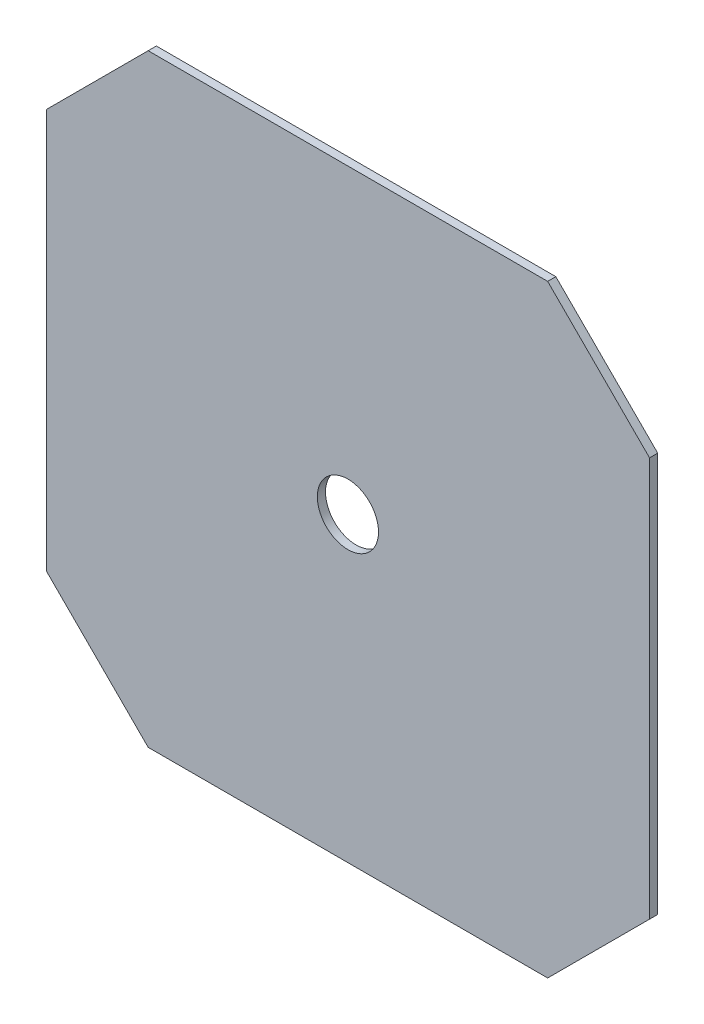
ISO-10303-21;
HEADER;
FILE_DESCRIPTION(('STEP AP214'),'2;1');
FILE_NAME('part.step','',(''),(''),'','','');
FILE_SCHEMA(('AUTOMOTIVE_DESIGN { 1 0 10303 214 1 1 1 1 }'));
ENDSEC;
DATA;
#1=APPLICATION_CONTEXT('core data for automotive mechanical design processes');
#2=APPLICATION_PROTOCOL_DEFINITION('international standard','automotive_design',2000,#1);
#3=PRODUCT_CONTEXT('',#1,'mechanical');
#4=PRODUCT('Part','Part','',(#3));
#5=PRODUCT_RELATED_PRODUCT_CATEGORY('part','',(#4));
#6=PRODUCT_DEFINITION_FORMATION('','',#4);
#7=PRODUCT_DEFINITION_CONTEXT('part definition',#1,'design');
#8=PRODUCT_DEFINITION('design','',#6,#7);
#9=PRODUCT_DEFINITION_SHAPE('','',#8);
#10=(LENGTH_UNIT() NAMED_UNIT(*) SI_UNIT(.MILLI.,.METRE.));
#11=(NAMED_UNIT(*) PLANE_ANGLE_UNIT() SI_UNIT($,.RADIAN.));
#12=(NAMED_UNIT(*) SI_UNIT($,.STERADIAN.) SOLID_ANGLE_UNIT());
#13=UNCERTAINTY_MEASURE_WITH_UNIT(LENGTH_MEASURE(1.E-05),#10,'distance_accuracy_value','');
#14=(GEOMETRIC_REPRESENTATION_CONTEXT(3) GLOBAL_UNCERTAINTY_ASSIGNED_CONTEXT((#13)) GLOBAL_UNIT_ASSIGNED_CONTEXT((#10,
#11,#12)) REPRESENTATION_CONTEXT('',''));
#15=CARTESIAN_POINT('',(0.,0.,0.));
#16=DIRECTION('',(0.,0.,1.));
#17=DIRECTION('',(1.,0.,0.));
#18=AXIS2_PLACEMENT_3D('',#15,#16,#17);
#19=CARTESIAN_POINT('',(-74.,-49.,2.));
#20=DIRECTION('',(1.,0.,0.));
#21=DIRECTION('',(0.,0.,-1.));
#22=AXIS2_PLACEMENT_3D('',#19,#20,#21);
#23=PLANE('',#22);
#24=DIRECTION('',(0.,-1.,0.));
#25=VECTOR('',#24,1.);
#26=CARTESIAN_POINT('',(-74.,-49.,0.));
#27=LINE('',#26,#25);
#28=CARTESIAN_POINT('',(-74.,49.,0.));
#29=VERTEX_POINT('',#28);
#30=CARTESIAN_POINT('',(-74.,-49.,0.));
#31=VERTEX_POINT('',#30);
#32=EDGE_CURVE('E130',#29,#31,#27,.T.);
#33=ORIENTED_EDGE('',*,*,#32,.T.);
#34=DIRECTION('',(0.,0.,-1.));
#35=VECTOR('',#34,1.);
#36=CARTESIAN_POINT('',(-74.,-49.,2.));
#37=LINE('',#36,#35);
#38=CARTESIAN_POINT('',(-74.,-49.,2.));
#39=VERTEX_POINT('',#38);
#40=EDGE_CURVE('E11',#39,#31,#37,.T.);
#41=ORIENTED_EDGE('',*,*,#40,.F.);
#42=DIRECTION('',(0.,-1.,0.));
#43=VECTOR('',#42,1.);
#44=CARTESIAN_POINT('',(-74.,-49.,2.));
#45=LINE('',#44,#43);
#46=CARTESIAN_POINT('',(-74.,49.,2.));
#47=VERTEX_POINT('',#46);
#48=EDGE_CURVE('E144',#47,#39,#45,.T.);
#49=ORIENTED_EDGE('',*,*,#48,.F.);
#50=DIRECTION('',(0.,0.,-1.));
#51=VECTOR('',#50,1.);
#52=CARTESIAN_POINT('',(-74.,49.,2.));
#53=LINE('',#52,#51);
#54=EDGE_CURVE('E126',#47,#29,#53,.T.);
#55=ORIENTED_EDGE('',*,*,#54,.T.);
#56=EDGE_LOOP('',(#33,#41,#49,#55));
#57=FACE_BOUND('',#56,.T.);
#58=ADVANCED_FACE('F33',(#57),#23,.F.);
#59=CARTESIAN_POINT('',(-74.,-49.,2.));
#60=DIRECTION('',(0.707106781186547,0.707106781186547,0.));
#61=DIRECTION('',(-0.707106781186548,0.707106781186548,0.));
#62=AXIS2_PLACEMENT_3D('',#59,#60,#61);
#63=PLANE('',#62);
#64=DIRECTION('',(0.707106781186547,-0.707106781186547,0.));
#65=VECTOR('',#64,1.);
#66=CARTESIAN_POINT('',(-74.,-49.,0.));
#67=LINE('',#66,#65);
#68=CARTESIAN_POINT('',(-49.,-74.,0.));
#69=VERTEX_POINT('',#68);
#70=EDGE_CURVE('E133',#31,#69,#67,.T.);
#71=ORIENTED_EDGE('',*,*,#70,.T.);
#72=DIRECTION('',(0.,0.,-1.));
#73=VECTOR('',#72,1.);
#74=CARTESIAN_POINT('',(-49.,-74.,2.));
#75=LINE('',#74,#73);
#76=CARTESIAN_POINT('',(-49.,-74.,2.));
#77=VERTEX_POINT('',#76);
#78=EDGE_CURVE('E42',#77,#69,#75,.T.);
#79=ORIENTED_EDGE('',*,*,#78,.F.);
#80=DIRECTION('',(0.707106781186547,-0.707106781186547,0.));
#81=VECTOR('',#80,1.);
#82=CARTESIAN_POINT('',(-74.,-49.,2.));
#83=LINE('',#82,#81);
#84=EDGE_CURVE('E93',#39,#77,#83,.T.);
#85=ORIENTED_EDGE('',*,*,#84,.F.);
#86=ORIENTED_EDGE('',*,*,#40,.T.);
#87=EDGE_LOOP('',(#71,#79,#85,#86));
#88=FACE_BOUND('',#87,.T.);
#89=ADVANCED_FACE('F200',(#88),#63,.F.);
#90=CARTESIAN_POINT('',(-49.,-74.,2.));
#91=DIRECTION('',(0.,1.,0.));
#92=DIRECTION('',(0.,0.,1.));
#93=AXIS2_PLACEMENT_3D('',#90,#91,#92);
#94=PLANE('',#93);
#95=DIRECTION('',(1.,0.,0.));
#96=VECTOR('',#95,1.);
#97=CARTESIAN_POINT('',(-49.,-74.,0.));
#98=LINE('',#97,#96);
#99=CARTESIAN_POINT('',(49.,-74.,0.));
#100=VERTEX_POINT('',#99);
#101=EDGE_CURVE('E135',#69,#100,#98,.T.);
#102=ORIENTED_EDGE('',*,*,#101,.T.);
#103=DIRECTION('',(0.,0.,-1.));
#104=VECTOR('',#103,1.);
#105=CARTESIAN_POINT('',(49.,-74.,2.));
#106=LINE('',#105,#104);
#107=CARTESIAN_POINT('',(49.,-74.,2.));
#108=VERTEX_POINT('',#107);
#109=EDGE_CURVE('E151',#108,#100,#106,.T.);
#110=ORIENTED_EDGE('',*,*,#109,.F.);
#111=DIRECTION('',(1.,0.,0.));
#112=VECTOR('',#111,1.);
#113=CARTESIAN_POINT('',(-49.,-74.,2.));
#114=LINE('',#113,#112);
#115=EDGE_CURVE('E160',#77,#108,#114,.T.);
#116=ORIENTED_EDGE('',*,*,#115,.F.);
#117=ORIENTED_EDGE('',*,*,#78,.T.);
#118=EDGE_LOOP('',(#102,#110,#116,#117));
#119=FACE_BOUND('',#118,.T.);
#120=ADVANCED_FACE('F158',(#119),#94,.F.);
#121=CARTESIAN_POINT('',(49.,-74.,2.));
#122=DIRECTION('',(-0.707106781186547,0.707106781186547,0.));
#123=DIRECTION('',(-0.707106781186548,-0.707106781186548,0.));
#124=AXIS2_PLACEMENT_3D('',#121,#122,#123);
#125=PLANE('',#124);
#126=DIRECTION('',(0.707106781186547,0.707106781186547,0.));
#127=VECTOR('',#126,1.);
#128=CARTESIAN_POINT('',(49.,-74.,0.));
#129=LINE('',#128,#127);
#130=CARTESIAN_POINT('',(74.,-49.,0.));
#131=VERTEX_POINT('',#130);
#132=EDGE_CURVE('E137',#100,#131,#129,.T.);
#133=ORIENTED_EDGE('',*,*,#132,.T.);
#134=DIRECTION('',(0.,0.,-1.));
#135=VECTOR('',#134,1.);
#136=CARTESIAN_POINT('',(74.,-49.,2.));
#137=LINE('',#136,#135);
#138=CARTESIAN_POINT('',(74.,-49.,2.));
#139=VERTEX_POINT('',#138);
#140=EDGE_CURVE('E148',#139,#131,#137,.T.);
#141=ORIENTED_EDGE('',*,*,#140,.F.);
#142=DIRECTION('',(0.707106781186547,0.707106781186547,0.));
#143=VECTOR('',#142,1.);
#144=CARTESIAN_POINT('',(49.,-74.,2.));
#145=LINE('',#144,#143);
#146=EDGE_CURVE('E172',#108,#139,#145,.T.);
#147=ORIENTED_EDGE('',*,*,#146,.F.);
#148=ORIENTED_EDGE('',*,*,#109,.T.);
#149=EDGE_LOOP('',(#133,#141,#147,#148));
#150=FACE_BOUND('',#149,.T.);
#151=ADVANCED_FACE('F168',(#150),#125,.F.);
#152=CARTESIAN_POINT('',(74.,-49.,2.));
#153=DIRECTION('',(-1.,0.,0.));
#154=DIRECTION('',(0.,0.,1.));
#155=AXIS2_PLACEMENT_3D('',#152,#153,#154);
#156=PLANE('',#155);
#157=DIRECTION('',(0.,1.,0.));
#158=VECTOR('',#157,1.);
#159=CARTESIAN_POINT('',(74.,-49.,0.));
#160=LINE('',#159,#158);
#161=CARTESIAN_POINT('',(74.,49.,0.));
#162=VERTEX_POINT('',#161);
#163=EDGE_CURVE('E139',#131,#162,#160,.T.);
#164=ORIENTED_EDGE('',*,*,#163,.T.);
#165=DIRECTION('',(0.,0.,-1.));
#166=VECTOR('',#165,1.);
#167=CARTESIAN_POINT('',(74.,49.,2.));
#168=LINE('',#167,#166);
#169=CARTESIAN_POINT('',(74.,49.,2.));
#170=VERTEX_POINT('',#169);
#171=EDGE_CURVE('E121',#170,#162,#168,.T.);
#172=ORIENTED_EDGE('',*,*,#171,.F.);
#173=DIRECTION('',(0.,1.,0.));
#174=VECTOR('',#173,1.);
#175=CARTESIAN_POINT('',(74.,-49.,2.));
#176=LINE('',#175,#174);
#177=EDGE_CURVE('E112',#139,#170,#176,.T.);
#178=ORIENTED_EDGE('',*,*,#177,.F.);
#179=ORIENTED_EDGE('',*,*,#140,.T.);
#180=EDGE_LOOP('',(#164,#172,#178,#179));
#181=FACE_BOUND('',#180,.T.);
#182=ADVANCED_FACE('F171',(#181),#156,.F.);
#183=CARTESIAN_POINT('',(49.,74.,2.));
#184=DIRECTION('',(-0.707106781186547,-0.707106781186547,0.));
#185=DIRECTION('',(0.707106781186548,-0.707106781186548,0.));
#186=AXIS2_PLACEMENT_3D('',#183,#184,#185);
#187=PLANE('',#186);
#188=DIRECTION('',(-0.707106781186547,0.707106781186547,0.));
#189=VECTOR('',#188,1.);
#190=CARTESIAN_POINT('',(49.,74.,0.));
#191=LINE('',#190,#189);
#192=CARTESIAN_POINT('',(49.,74.,0.));
#193=VERTEX_POINT('',#192);
#194=EDGE_CURVE('E120',#162,#193,#191,.T.);
#195=ORIENTED_EDGE('',*,*,#194,.T.);
#196=DIRECTION('',(0.,0.,-1.));
#197=VECTOR('',#196,1.);
#198=CARTESIAN_POINT('',(49.,74.,2.));
#199=LINE('',#198,#197);
#200=CARTESIAN_POINT('',(49.,74.,2.));
#201=VERTEX_POINT('',#200);
#202=EDGE_CURVE('E117',#201,#193,#199,.T.);
#203=ORIENTED_EDGE('',*,*,#202,.F.);
#204=DIRECTION('',(-0.707106781186547,0.707106781186547,0.));
#205=VECTOR('',#204,1.);
#206=CARTESIAN_POINT('',(49.,74.,2.));
#207=LINE('',#206,#205);
#208=EDGE_CURVE('E106',#170,#201,#207,.T.);
#209=ORIENTED_EDGE('',*,*,#208,.F.);
#210=ORIENTED_EDGE('',*,*,#171,.T.);
#211=EDGE_LOOP('',(#195,#203,#209,#210));
#212=FACE_BOUND('',#211,.T.);
#213=ADVANCED_FACE('F118',(#212),#187,.F.);
#214=CARTESIAN_POINT('',(-49.,74.,2.));
#215=DIRECTION('',(0.,-1.,0.));
#216=DIRECTION('',(0.,0.,-1.));
#217=AXIS2_PLACEMENT_3D('',#214,#215,#216);
#218=PLANE('',#217);
#219=DIRECTION('',(-1.,0.,0.));
#220=VECTOR('',#219,1.);
#221=CARTESIAN_POINT('',(-49.,74.,0.));
#222=LINE('',#221,#220);
#223=CARTESIAN_POINT('',(-49.,74.,0.));
#224=VERTEX_POINT('',#223);
#225=EDGE_CURVE('E79',#193,#224,#222,.T.);
#226=ORIENTED_EDGE('',*,*,#225,.T.);
#227=DIRECTION('',(0.,0.,-1.));
#228=VECTOR('',#227,1.);
#229=CARTESIAN_POINT('',(-49.,74.,2.));
#230=LINE('',#229,#228);
#231=CARTESIAN_POINT('',(-49.,74.,2.));
#232=VERTEX_POINT('',#231);
#233=EDGE_CURVE('E122',#232,#224,#230,.T.);
#234=ORIENTED_EDGE('',*,*,#233,.F.);
#235=DIRECTION('',(-1.,0.,0.));
#236=VECTOR('',#235,1.);
#237=CARTESIAN_POINT('',(-49.,74.,2.));
#238=LINE('',#237,#236);
#239=EDGE_CURVE('E110',#201,#232,#238,.T.);
#240=ORIENTED_EDGE('',*,*,#239,.F.);
#241=ORIENTED_EDGE('',*,*,#202,.T.);
#242=EDGE_LOOP('',(#226,#234,#240,#241));
#243=FACE_BOUND('',#242,.T.);
#244=ADVANCED_FACE('F124',(#243),#218,.F.);
#245=CARTESIAN_POINT('',(-74.,49.,2.));
#246=DIRECTION('',(0.707106781186547,-0.707106781186547,0.));
#247=DIRECTION('',(0.707106781186548,0.707106781186548,0.));
#248=AXIS2_PLACEMENT_3D('',#245,#246,#247);
#249=PLANE('',#248);
#250=DIRECTION('',(-0.707106781186547,-0.707106781186547,0.));
#251=VECTOR('',#250,1.);
#252=CARTESIAN_POINT('',(-74.,49.,0.));
#253=LINE('',#252,#251);
#254=EDGE_CURVE('E85',#224,#29,#253,.T.);
#255=ORIENTED_EDGE('',*,*,#254,.T.);
#256=ORIENTED_EDGE('',*,*,#54,.F.);
#257=DIRECTION('',(-0.707106781186547,-0.707106781186547,0.));
#258=VECTOR('',#257,1.);
#259=CARTESIAN_POINT('',(-74.,49.,2.));
#260=LINE('',#259,#258);
#261=EDGE_CURVE('E50',#232,#47,#260,.T.);
#262=ORIENTED_EDGE('',*,*,#261,.F.);
#263=ORIENTED_EDGE('',*,*,#233,.T.);
#264=EDGE_LOOP('',(#255,#256,#262,#263));
#265=FACE_BOUND('',#264,.T.);
#266=ADVANCED_FACE('F195',(#265),#249,.F.);
#267=CARTESIAN_POINT('',(0.,0.,2.));
#268=DIRECTION('',(0.,0.,-1.));
#269=DIRECTION('',(-1.,0.,0.));
#270=AXIS2_PLACEMENT_3D('',#267,#268,#269);
#271=PLANE('',#270);
#272=CARTESIAN_POINT('',(0.,0.,2.));
#273=DIRECTION('',(0.,0.,1.));
#274=DIRECTION('',(1.,0.,0.));
#275=AXIS2_PLACEMENT_3D('',#272,#273,#274);
#276=CIRCLE('',#275,7.5);
#277=CARTESIAN_POINT('',(7.5,0.,2.));
#278=VERTEX_POINT('',#277);
#279=EDGE_CURVE('E178',#278,#278,#276,.T.);
#280=ORIENTED_EDGE('',*,*,#279,.F.);
#281=EDGE_LOOP('',(#280));
#282=FACE_BOUND('',#281,.T.);
#283=ORIENTED_EDGE('',*,*,#48,.T.);
#284=ORIENTED_EDGE('',*,*,#84,.T.);
#285=ORIENTED_EDGE('',*,*,#115,.T.);
#286=ORIENTED_EDGE('',*,*,#146,.T.);
#287=ORIENTED_EDGE('',*,*,#177,.T.);
#288=ORIENTED_EDGE('',*,*,#208,.T.);
#289=ORIENTED_EDGE('',*,*,#239,.T.);
#290=ORIENTED_EDGE('',*,*,#261,.T.);
#291=EDGE_LOOP('',(#283,#284,#285,#286,#287,#288,#289,#290));
#292=FACE_BOUND('',#291,.T.);
#293=ADVANCED_FACE('F108',(#282,#292),#271,.F.);
#294=CARTESIAN_POINT('',(0.,0.,0.));
#295=DIRECTION('',(0.,0.,-1.));
#296=DIRECTION('',(-1.,0.,0.));
#297=AXIS2_PLACEMENT_3D('',#294,#295,#296);
#298=PLANE('',#297);
#299=CARTESIAN_POINT('',(0.,0.,0.));
#300=DIRECTION('',(0.,0.,-1.));
#301=DIRECTION('',(-1.,0.,0.));
#302=AXIS2_PLACEMENT_3D('',#299,#300,#301);
#303=CIRCLE('',#302,7.5);
#304=CARTESIAN_POINT('',(-7.5,0.,0.));
#305=VERTEX_POINT('',#304);
#306=EDGE_CURVE('E36',#305,#305,#303,.T.);
#307=ORIENTED_EDGE('',*,*,#306,.F.);
#308=EDGE_LOOP('',(#307));
#309=FACE_BOUND('',#308,.T.);
#310=ORIENTED_EDGE('',*,*,#32,.F.);
#311=ORIENTED_EDGE('',*,*,#254,.F.);
#312=ORIENTED_EDGE('',*,*,#225,.F.);
#313=ORIENTED_EDGE('',*,*,#194,.F.);
#314=ORIENTED_EDGE('',*,*,#163,.F.);
#315=ORIENTED_EDGE('',*,*,#132,.F.);
#316=ORIENTED_EDGE('',*,*,#101,.F.);
#317=ORIENTED_EDGE('',*,*,#70,.F.);
#318=EDGE_LOOP('',(#310,#311,#312,#313,#314,#315,#316,#317));
#319=FACE_BOUND('',#318,.T.);
#320=ADVANCED_FACE('F164',(#309,#319),#298,.T.);
#321=CARTESIAN_POINT('',(0.,0.,-8.));
#322=DIRECTION('',(0.,0.,1.));
#323=DIRECTION('',(1.,0.,0.));
#324=AXIS2_PLACEMENT_3D('',#321,#322,#323);
#325=CYLINDRICAL_SURFACE('',#324,7.5);
#326=ORIENTED_EDGE('',*,*,#306,.T.);
#327=EDGE_LOOP('',(#326));
#328=FACE_BOUND('',#327,.T.);
#329=ORIENTED_EDGE('',*,*,#279,.T.);
#330=EDGE_LOOP('',(#329));
#331=FACE_BOUND('',#330,.T.);
#332=ADVANCED_FACE('F185',(#328,#331),#325,.F.);
#333=CLOSED_SHELL('',(#58,#89,#120,#151,#182,#213,#244,#266,#293,#320,#332));
#334=MANIFOLD_SOLID_BREP('B2',#333);
#335=ADVANCED_BREP_SHAPE_REPRESENTATION('',(#18,#334),#14);
#336=SHAPE_DEFINITION_REPRESENTATION(#9,#335);
ENDSEC;
END-ISO-10303-21;
